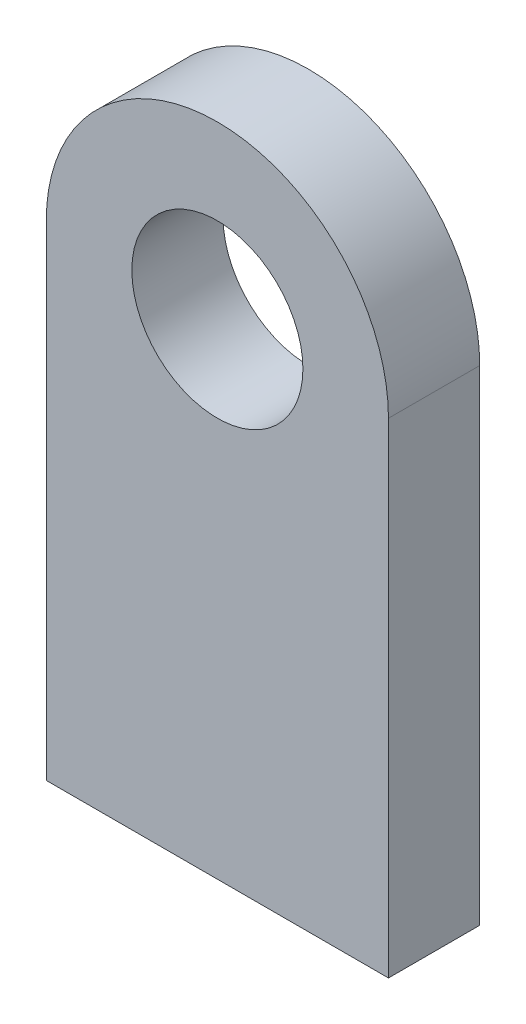
ISO-10303-21;
HEADER;
FILE_DESCRIPTION(('STEP AP214'),'2;1');
FILE_NAME('part.step','',(''),(''),'','','');
FILE_SCHEMA(('AUTOMOTIVE_DESIGN { 1 0 10303 214 1 1 1 1 }'));
ENDSEC;
DATA;
#1=APPLICATION_CONTEXT('core data for automotive mechanical design processes');
#2=APPLICATION_PROTOCOL_DEFINITION('international standard','automotive_design',2000,#1);
#3=PRODUCT_CONTEXT('',#1,'mechanical');
#4=PRODUCT('Part','Part','',(#3));
#5=PRODUCT_RELATED_PRODUCT_CATEGORY('part','',(#4));
#6=PRODUCT_DEFINITION_FORMATION('','',#4);
#7=PRODUCT_DEFINITION_CONTEXT('part definition',#1,'design');
#8=PRODUCT_DEFINITION('design','',#6,#7);
#9=PRODUCT_DEFINITION_SHAPE('','',#8);
#10=(LENGTH_UNIT() NAMED_UNIT(*) SI_UNIT(.MILLI.,.METRE.));
#11=(NAMED_UNIT(*) PLANE_ANGLE_UNIT() SI_UNIT($,.RADIAN.));
#12=(NAMED_UNIT(*) SI_UNIT($,.STERADIAN.) SOLID_ANGLE_UNIT());
#13=UNCERTAINTY_MEASURE_WITH_UNIT(LENGTH_MEASURE(1.E-05),#10,'distance_accuracy_value','');
#14=(GEOMETRIC_REPRESENTATION_CONTEXT(3) GLOBAL_UNCERTAINTY_ASSIGNED_CONTEXT((#13)) GLOBAL_UNIT_ASSIGNED_CONTEXT((#10,
#11,#12)) REPRESENTATION_CONTEXT('',''));
#15=CARTESIAN_POINT('',(0.,0.,0.));
#16=DIRECTION('',(0.,0.,1.));
#17=DIRECTION('',(1.,0.,0.));
#18=AXIS2_PLACEMENT_3D('',#15,#16,#17);
#19=CARTESIAN_POINT('',(0.,0.,16.));
#20=DIRECTION('',(0.,0.,1.));
#21=DIRECTION('',(1.,0.,0.));
#22=AXIS2_PLACEMENT_3D('',#19,#20,#21);
#23=PLANE('',#22);
#24=CARTESIAN_POINT('',(0.,0.,16.));
#25=DIRECTION('',(0.,0.,1.));
#26=DIRECTION('',(1.,0.,0.));
#27=AXIS2_PLACEMENT_3D('',#24,#25,#26);
#28=CIRCLE('',#27,30.);
#29=CARTESIAN_POINT('',(30.,0.,16.));
#30=VERTEX_POINT('',#29);
#31=CARTESIAN_POINT('',(-30.,0.,16.));
#32=VERTEX_POINT('',#31);
#33=EDGE_CURVE('E86',#30,#32,#28,.T.);
#34=ORIENTED_EDGE('',*,*,#33,.T.);
#35=DIRECTION('',(0.,-1.,0.));
#36=VECTOR('',#35,1.);
#37=CARTESIAN_POINT('',(-30.,0.,16.));
#38=LINE('',#37,#36);
#39=CARTESIAN_POINT('',(-30.,-85.,16.));
#40=VERTEX_POINT('',#39);
#41=EDGE_CURVE('E81',#32,#40,#38,.T.);
#42=ORIENTED_EDGE('',*,*,#41,.T.);
#43=DIRECTION('',(1.,0.,0.));
#44=VECTOR('',#43,1.);
#45=CARTESIAN_POINT('',(30.,-85.,16.));
#46=LINE('',#45,#44);
#47=CARTESIAN_POINT('',(30.,-85.,16.));
#48=VERTEX_POINT('',#47);
#49=EDGE_CURVE('E84',#40,#48,#46,.T.);
#50=ORIENTED_EDGE('',*,*,#49,.T.);
#51=DIRECTION('',(0.,1.,0.));
#52=VECTOR('',#51,1.);
#53=CARTESIAN_POINT('',(30.,0.,16.));
#54=LINE('',#53,#52);
#55=EDGE_CURVE('E51',#48,#30,#54,.T.);
#56=ORIENTED_EDGE('',*,*,#55,.T.);
#57=EDGE_LOOP('',(#34,#42,#50,#56));
#58=FACE_BOUND('',#57,.T.);
#59=CARTESIAN_POINT('',(0.,0.,16.));
#60=DIRECTION('',(0.,0.,1.));
#61=DIRECTION('',(1.,0.,0.));
#62=AXIS2_PLACEMENT_3D('',#59,#60,#61);
#63=CIRCLE('',#62,15.);
#64=CARTESIAN_POINT('',(15.,0.,16.));
#65=VERTEX_POINT('',#64);
#66=EDGE_CURVE('E101',#65,#65,#63,.T.);
#67=ORIENTED_EDGE('',*,*,#66,.F.);
#68=EDGE_LOOP('',(#67));
#69=FACE_BOUND('',#68,.T.);
#70=ADVANCED_FACE('F34',(#58,#69),#23,.T.);
#71=CARTESIAN_POINT('',(0.,0.,0.));
#72=DIRECTION('',(0.,0.,1.));
#73=DIRECTION('',(1.,0.,0.));
#74=AXIS2_PLACEMENT_3D('',#71,#72,#73);
#75=PLANE('',#74);
#76=CARTESIAN_POINT('',(0.,0.,0.));
#77=DIRECTION('',(0.,0.,1.));
#78=DIRECTION('',(1.,0.,0.));
#79=AXIS2_PLACEMENT_3D('',#76,#77,#78);
#80=CIRCLE('',#79,30.);
#81=CARTESIAN_POINT('',(30.,0.,0.));
#82=VERTEX_POINT('',#81);
#83=CARTESIAN_POINT('',(-30.,0.,0.));
#84=VERTEX_POINT('',#83);
#85=EDGE_CURVE('E98',#82,#84,#80,.T.);
#86=ORIENTED_EDGE('',*,*,#85,.F.);
#87=DIRECTION('',(0.,1.,0.));
#88=VECTOR('',#87,1.);
#89=CARTESIAN_POINT('',(30.,0.,0.));
#90=LINE('',#89,#88);
#91=CARTESIAN_POINT('',(30.,-85.,0.));
#92=VERTEX_POINT('',#91);
#93=EDGE_CURVE('E74',#92,#82,#90,.T.);
#94=ORIENTED_EDGE('',*,*,#93,.F.);
#95=DIRECTION('',(1.,0.,0.));
#96=VECTOR('',#95,1.);
#97=CARTESIAN_POINT('',(30.,-85.,0.));
#98=LINE('',#97,#96);
#99=CARTESIAN_POINT('',(-30.,-85.,0.));
#100=VERTEX_POINT('',#99);
#101=EDGE_CURVE('E68',#100,#92,#98,.T.);
#102=ORIENTED_EDGE('',*,*,#101,.F.);
#103=DIRECTION('',(0.,-1.,0.));
#104=VECTOR('',#103,1.);
#105=CARTESIAN_POINT('',(-30.,0.,0.));
#106=LINE('',#105,#104);
#107=EDGE_CURVE('E90',#84,#100,#106,.T.);
#108=ORIENTED_EDGE('',*,*,#107,.F.);
#109=EDGE_LOOP('',(#86,#94,#102,#108));
#110=FACE_BOUND('',#109,.T.);
#111=CARTESIAN_POINT('',(0.,0.,0.));
#112=DIRECTION('',(0.,0.,1.));
#113=DIRECTION('',(1.,0.,0.));
#114=AXIS2_PLACEMENT_3D('',#111,#112,#113);
#115=CIRCLE('',#114,15.);
#116=CARTESIAN_POINT('',(15.,0.,0.));
#117=VERTEX_POINT('',#116);
#118=EDGE_CURVE('E113',#117,#117,#115,.T.);
#119=ORIENTED_EDGE('',*,*,#118,.T.);
#120=EDGE_LOOP('',(#119));
#121=FACE_BOUND('',#120,.T.);
#122=ADVANCED_FACE('F109',(#110,#121),#75,.F.);
#123=CARTESIAN_POINT('',(0.,0.,16.));
#124=DIRECTION('',(0.,0.,-1.));
#125=DIRECTION('',(-1.,0.,0.));
#126=AXIS2_PLACEMENT_3D('',#123,#124,#125);
#127=CYLINDRICAL_SURFACE('',#126,30.);
#128=ORIENTED_EDGE('',*,*,#85,.T.);
#129=DIRECTION('',(0.,0.,-1.));
#130=VECTOR('',#129,1.);
#131=CARTESIAN_POINT('',(-30.,0.,16.));
#132=LINE('',#131,#130);
#133=EDGE_CURVE('E11',#32,#84,#132,.T.);
#134=ORIENTED_EDGE('',*,*,#133,.F.);
#135=ORIENTED_EDGE('',*,*,#33,.F.);
#136=DIRECTION('',(0.,0.,-1.));
#137=VECTOR('',#136,1.);
#138=CARTESIAN_POINT('',(30.,0.,16.));
#139=LINE('',#138,#137);
#140=EDGE_CURVE('E94',#30,#82,#139,.T.);
#141=ORIENTED_EDGE('',*,*,#140,.T.);
#142=EDGE_LOOP('',(#128,#134,#135,#141));
#143=FACE_BOUND('',#142,.T.);
#144=ADVANCED_FACE('F36',(#143),#127,.T.);
#145=CARTESIAN_POINT('',(-30.,0.,16.));
#146=DIRECTION('',(1.,0.,0.));
#147=DIRECTION('',(0.,0.,-1.));
#148=AXIS2_PLACEMENT_3D('',#145,#146,#147);
#149=PLANE('',#148);
#150=ORIENTED_EDGE('',*,*,#107,.T.);
#151=DIRECTION('',(0.,0.,-1.));
#152=VECTOR('',#151,1.);
#153=CARTESIAN_POINT('',(-30.,-85.,16.));
#154=LINE('',#153,#152);
#155=EDGE_CURVE('E43',#40,#100,#154,.T.);
#156=ORIENTED_EDGE('',*,*,#155,.F.);
#157=ORIENTED_EDGE('',*,*,#41,.F.);
#158=ORIENTED_EDGE('',*,*,#133,.T.);
#159=EDGE_LOOP('',(#150,#156,#157,#158));
#160=FACE_BOUND('',#159,.T.);
#161=ADVANCED_FACE('F89',(#160),#149,.F.);
#162=CARTESIAN_POINT('',(30.,-85.,16.));
#163=DIRECTION('',(0.,1.,0.));
#164=DIRECTION('',(-1.,0.,0.));
#165=AXIS2_PLACEMENT_3D('',#162,#163,#164);
#166=PLANE('',#165);
#167=ORIENTED_EDGE('',*,*,#101,.T.);
#168=DIRECTION('',(0.,0.,-1.));
#169=VECTOR('',#168,1.);
#170=CARTESIAN_POINT('',(30.,-85.,16.));
#171=LINE('',#170,#169);
#172=EDGE_CURVE('E91',#48,#92,#171,.T.);
#173=ORIENTED_EDGE('',*,*,#172,.F.);
#174=ORIENTED_EDGE('',*,*,#49,.F.);
#175=ORIENTED_EDGE('',*,*,#155,.T.);
#176=EDGE_LOOP('',(#167,#173,#174,#175));
#177=FACE_BOUND('',#176,.T.);
#178=ADVANCED_FACE('F92',(#177),#166,.F.);
#179=CARTESIAN_POINT('',(30.,0.,16.));
#180=DIRECTION('',(-1.,0.,0.));
#181=DIRECTION('',(0.,0.,1.));
#182=AXIS2_PLACEMENT_3D('',#179,#180,#181);
#183=PLANE('',#182);
#184=ORIENTED_EDGE('',*,*,#93,.T.);
#185=ORIENTED_EDGE('',*,*,#140,.F.);
#186=ORIENTED_EDGE('',*,*,#55,.F.);
#187=ORIENTED_EDGE('',*,*,#172,.T.);
#188=EDGE_LOOP('',(#184,#185,#186,#187));
#189=FACE_BOUND('',#188,.T.);
#190=ADVANCED_FACE('F106',(#189),#183,.F.);
#191=CARTESIAN_POINT('',(0.,0.,16.));
#192=DIRECTION('',(0.,0.,-1.));
#193=DIRECTION('',(-1.,0.,0.));
#194=AXIS2_PLACEMENT_3D('',#191,#192,#193);
#195=CYLINDRICAL_SURFACE('',#194,15.);
#196=ORIENTED_EDGE('',*,*,#66,.T.);
#197=EDGE_LOOP('',(#196));
#198=FACE_BOUND('',#197,.T.);
#199=ORIENTED_EDGE('',*,*,#118,.F.);
#200=EDGE_LOOP('',(#199));
#201=FACE_BOUND('',#200,.T.);
#202=ADVANCED_FACE('F119',(#198,#201),#195,.F.);
#203=CLOSED_SHELL('',(#70,#122,#144,#161,#178,#190,#202));
#204=MANIFOLD_SOLID_BREP('B2',#203);
#205=ADVANCED_BREP_SHAPE_REPRESENTATION('',(#18,#204),#14);
#206=SHAPE_DEFINITION_REPRESENTATION(#9,#205);
ENDSEC;
END-ISO-10303-21;
